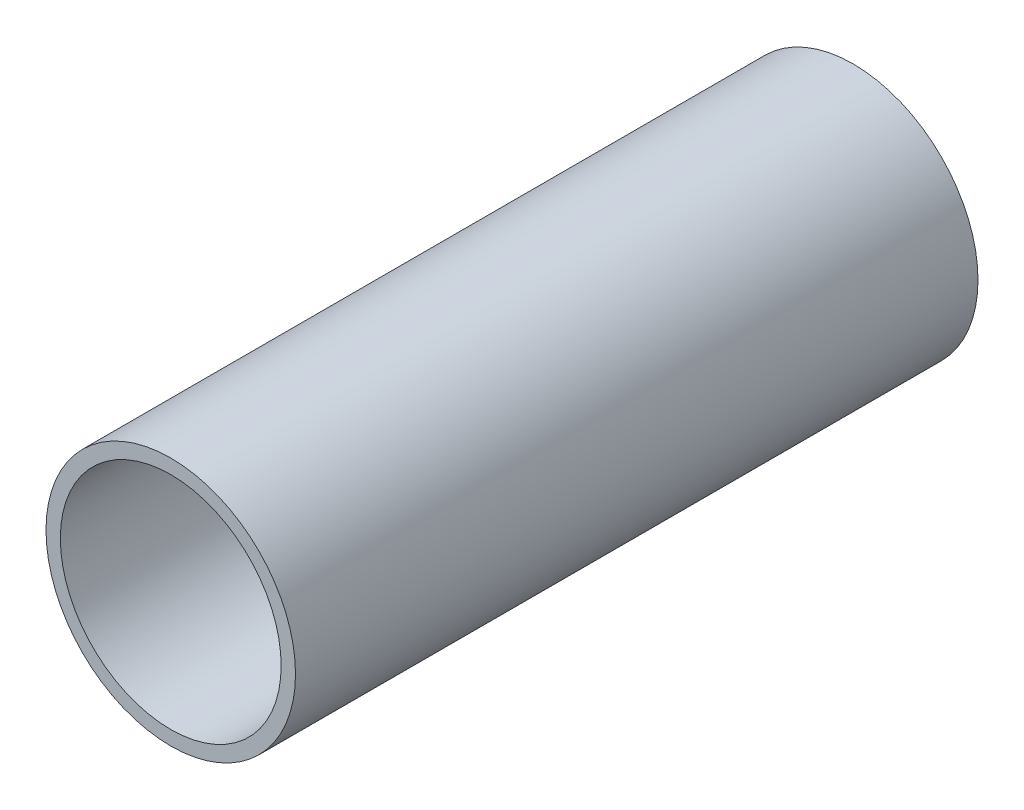
ISO-10303-21;
HEADER;
FILE_DESCRIPTION(('STEP AP214'),'2;1');
FILE_NAME('part.step','',(''),(''),'','','');
FILE_SCHEMA(('AUTOMOTIVE_DESIGN { 1 0 10303 214 1 1 1 1 }'));
ENDSEC;
DATA;
#1=APPLICATION_CONTEXT('core data for automotive mechanical design processes');
#2=APPLICATION_PROTOCOL_DEFINITION('international standard','automotive_design',2000,#1);
#3=PRODUCT_CONTEXT('',#1,'mechanical');
#4=PRODUCT('Part','Part','',(#3));
#5=PRODUCT_RELATED_PRODUCT_CATEGORY('part','',(#4));
#6=PRODUCT_DEFINITION_FORMATION('','',#4);
#7=PRODUCT_DEFINITION_CONTEXT('part definition',#1,'design');
#8=PRODUCT_DEFINITION('design','',#6,#7);
#9=PRODUCT_DEFINITION_SHAPE('','',#8);
#10=(LENGTH_UNIT() NAMED_UNIT(*) SI_UNIT(.MILLI.,.METRE.));
#11=(NAMED_UNIT(*) PLANE_ANGLE_UNIT() SI_UNIT($,.RADIAN.));
#12=(NAMED_UNIT(*) SI_UNIT($,.STERADIAN.) SOLID_ANGLE_UNIT());
#13=UNCERTAINTY_MEASURE_WITH_UNIT(LENGTH_MEASURE(1.E-05),#10,'distance_accuracy_value','');
#14=(GEOMETRIC_REPRESENTATION_CONTEXT(3) GLOBAL_UNCERTAINTY_ASSIGNED_CONTEXT((#13)) GLOBAL_UNIT_ASSIGNED_CONTEXT((#10,
#11,#12)) REPRESENTATION_CONTEXT('',''));
#15=CARTESIAN_POINT('',(0.,0.,0.));
#16=DIRECTION('',(0.,0.,1.));
#17=DIRECTION('',(1.,0.,0.));
#18=AXIS2_PLACEMENT_3D('',#15,#16,#17);
#19=CARTESIAN_POINT('',(0.,0.,476.));
#20=DIRECTION('',(0.,0.,1.));
#21=DIRECTION('',(1.,0.,0.));
#22=AXIS2_PLACEMENT_3D('',#19,#20,#21);
#23=PLANE('',#22);
#24=CARTESIAN_POINT('',(0.,0.,476.));
#25=DIRECTION('',(0.,0.,1.));
#26=DIRECTION('',(1.,0.,0.));
#27=AXIS2_PLACEMENT_3D('',#24,#25,#26);
#28=CIRCLE('',#27,87.);
#29=CARTESIAN_POINT('',(-87.,0.,476.));
#30=VERTEX_POINT('',#29);
#31=EDGE_CURVE('E10',#30,#30,#28,.T.);
#32=ORIENTED_EDGE('',*,*,#31,.T.);
#33=EDGE_LOOP('',(#32));
#34=FACE_BOUND('',#33,.T.);
#35=CARTESIAN_POINT('',(0.,0.,476.));
#36=DIRECTION('',(0.,0.,1.));
#37=DIRECTION('',(1.,0.,0.));
#38=AXIS2_PLACEMENT_3D('',#35,#36,#37);
#39=CIRCLE('',#38,77.);
#40=CARTESIAN_POINT('',(-77.,0.,476.));
#41=VERTEX_POINT('',#40);
#42=EDGE_CURVE('E55',#41,#41,#39,.T.);
#43=ORIENTED_EDGE('',*,*,#42,.F.);
#44=EDGE_LOOP('',(#43));
#45=FACE_BOUND('',#44,.T.);
#46=ADVANCED_FACE('F42',(#34,#45),#23,.T.);
#47=CARTESIAN_POINT('',(0.,0.,0.));
#48=DIRECTION('',(0.,0.,1.));
#49=DIRECTION('',(1.,0.,0.));
#50=AXIS2_PLACEMENT_3D('',#47,#48,#49);
#51=PLANE('',#50);
#52=CARTESIAN_POINT('',(0.,0.,0.));
#53=DIRECTION('',(0.,0.,1.));
#54=DIRECTION('',(1.,0.,0.));
#55=AXIS2_PLACEMENT_3D('',#52,#53,#54);
#56=CIRCLE('',#55,87.);
#57=CARTESIAN_POINT('',(-87.,0.,0.));
#58=VERTEX_POINT('',#57);
#59=EDGE_CURVE('E46',#58,#58,#56,.T.);
#60=ORIENTED_EDGE('',*,*,#59,.F.);
#61=EDGE_LOOP('',(#60));
#62=FACE_BOUND('',#61,.T.);
#63=CARTESIAN_POINT('',(0.,0.,0.));
#64=DIRECTION('',(0.,0.,1.));
#65=DIRECTION('',(1.,0.,0.));
#66=AXIS2_PLACEMENT_3D('',#63,#64,#65);
#67=CIRCLE('',#66,77.);
#68=CARTESIAN_POINT('',(-77.,0.,0.));
#69=VERTEX_POINT('',#68);
#70=EDGE_CURVE('E57',#69,#69,#67,.T.);
#71=ORIENTED_EDGE('',*,*,#70,.T.);
#72=EDGE_LOOP('',(#71));
#73=FACE_BOUND('',#72,.T.);
#74=ADVANCED_FACE('F69',(#62,#73),#51,.F.);
#75=CARTESIAN_POINT('',(0.,0.,476.));
#76=DIRECTION('',(0.,0.,-1.));
#77=DIRECTION('',(-1.,0.,0.));
#78=AXIS2_PLACEMENT_3D('',#75,#76,#77);
#79=CYLINDRICAL_SURFACE('',#78,87.);
#80=CARTESIAN_POINT('',(-87.,0.,476.));
#81=CARTESIAN_POINT('',(-87.,0.,471.041666666667));
#82=CARTESIAN_POINT('',(-87.,0.,466.083333333333));
#83=CARTESIAN_POINT('',(-87.,0.,456.166666666667));
#84=CARTESIAN_POINT('',(-87.,0.,451.208333333333));
#85=CARTESIAN_POINT('',(-87.,0.,441.291666666667));
#86=CARTESIAN_POINT('',(-87.,0.,436.333333333333));
#87=CARTESIAN_POINT('',(-87.,0.,426.416666666667));
#88=CARTESIAN_POINT('',(-87.,0.,421.458333333333));
#89=CARTESIAN_POINT('',(-87.,0.,411.541666666667));
#90=CARTESIAN_POINT('',(-87.,0.,406.583333333333));
#91=CARTESIAN_POINT('',(-87.,0.,396.666666666667));
#92=CARTESIAN_POINT('',(-87.,0.,391.708333333333));
#93=CARTESIAN_POINT('',(-87.,0.,381.791666666667));
#94=CARTESIAN_POINT('',(-87.,0.,376.833333333333));
#95=CARTESIAN_POINT('',(-87.,0.,366.916666666667));
#96=CARTESIAN_POINT('',(-87.,0.,361.958333333333));
#97=CARTESIAN_POINT('',(-87.,0.,352.041666666667));
#98=CARTESIAN_POINT('',(-87.,0.,347.083333333333));
#99=CARTESIAN_POINT('',(-87.,0.,337.166666666667));
#100=CARTESIAN_POINT('',(-87.,0.,332.208333333333));
#101=CARTESIAN_POINT('',(-87.,0.,322.291666666667));
#102=CARTESIAN_POINT('',(-87.,0.,317.333333333333));
#103=CARTESIAN_POINT('',(-87.,0.,307.416666666667));
#104=CARTESIAN_POINT('',(-87.,0.,302.458333333333));
#105=CARTESIAN_POINT('',(-87.,0.,292.541666666667));
#106=CARTESIAN_POINT('',(-87.,0.,287.583333333333));
#107=CARTESIAN_POINT('',(-87.,0.,277.666666666667));
#108=CARTESIAN_POINT('',(-87.,0.,272.708333333333));
#109=CARTESIAN_POINT('',(-87.,0.,262.791666666667));
#110=CARTESIAN_POINT('',(-87.,0.,257.833333333333));
#111=CARTESIAN_POINT('',(-87.,0.,247.916666666667));
#112=CARTESIAN_POINT('',(-87.,0.,242.958333333333));
#113=CARTESIAN_POINT('',(-87.,0.,233.041666666667));
#114=CARTESIAN_POINT('',(-87.,0.,228.083333333333));
#115=CARTESIAN_POINT('',(-87.,0.,218.166666666667));
#116=CARTESIAN_POINT('',(-87.,0.,213.208333333333));
#117=CARTESIAN_POINT('',(-87.,0.,203.291666666667));
#118=CARTESIAN_POINT('',(-87.,0.,198.333333333333));
#119=CARTESIAN_POINT('',(-87.,0.,188.416666666667));
#120=CARTESIAN_POINT('',(-87.,0.,183.458333333333));
#121=CARTESIAN_POINT('',(-87.,0.,173.541666666667));
#122=CARTESIAN_POINT('',(-87.,0.,168.583333333333));
#123=CARTESIAN_POINT('',(-87.,0.,158.666666666667));
#124=CARTESIAN_POINT('',(-87.,0.,153.708333333333));
#125=CARTESIAN_POINT('',(-87.,0.,143.791666666667));
#126=CARTESIAN_POINT('',(-87.,0.,138.833333333333));
#127=CARTESIAN_POINT('',(-87.,0.,128.916666666667));
#128=CARTESIAN_POINT('',(-87.,0.,123.958333333333));
#129=CARTESIAN_POINT('',(-87.,0.,114.041666666667));
#130=CARTESIAN_POINT('',(-87.,0.,109.083333333333));
#131=CARTESIAN_POINT('',(-87.,0.,99.1666666666667));
#132=CARTESIAN_POINT('',(-87.,0.,94.2083333333333));
#133=CARTESIAN_POINT('',(-87.,0.,84.2916666666667));
#134=CARTESIAN_POINT('',(-87.,0.,79.3333333333334));
#135=CARTESIAN_POINT('',(-87.,0.,69.4166666666667));
#136=CARTESIAN_POINT('',(-87.,0.,64.4583333333333));
#137=CARTESIAN_POINT('',(-87.,0.,54.5416666666667));
#138=CARTESIAN_POINT('',(-87.,0.,49.5833333333334));
#139=CARTESIAN_POINT('',(-87.,0.,39.6666666666667));
#140=CARTESIAN_POINT('',(-87.,0.,34.7083333333333));
#141=CARTESIAN_POINT('',(-87.,0.,24.7916666666667));
#142=CARTESIAN_POINT('',(-87.,0.,19.8333333333334));
#143=CARTESIAN_POINT('',(-87.,0.,9.91666666666668));
#144=CARTESIAN_POINT('',(-87.,0.,4.95833333333333));
#145=CARTESIAN_POINT('',(-87.,0.,0.));
#146=B_SPLINE_CURVE_WITH_KNOTS('',3,(#80,#81,#82,#83,#84,#85,#86,#87,#88,#89,#90,#91,#92,#93,
#94,#95,#96,#97,#98,#99,#100,#101,#102,#103,#104,#105,#106,#107,#108,#109,#110,#111,#112,#113,
#114,#115,#116,#117,#118,#119,#120,#121,#122,#123,#124,#125,#126,#127,#128,#129,#130,#131,#132,
#133,#134,#135,#136,#137,#138,#139,#140,#141,#142,#143,#144,#145),.UNSPECIFIED.,.F.,.F.,(4,2,2,
2,2,2,2,2,2,2,2,2,2,2,2,2,2,2,2,2,2,2,2,2,2,2,2,2,2,2,2,2,4),(0.,14.875,29.7500000000001,44.625,
59.5,74.375,89.2500000000001,104.125,119.,133.875,148.75,163.625,178.5,193.375,208.25,223.125,
238.,252.875,267.75,282.625,297.5,312.375,327.25,342.125,357.,371.875,386.75,401.625,416.5,
431.375,446.25,461.125,476.),.UNSPECIFIED.);
#147=EDGE_CURVE('BSEAM44',#30,#58,#146,.T.);
#148=ORIENTED_EDGE('',*,*,#31,.F.);
#149=ORIENTED_EDGE('',*,*,#59,.T.);
#150=ORIENTED_EDGE('',*,*,#147,.T.);
#151=ORIENTED_EDGE('',*,*,#147,.F.);
#152=EDGE_LOOP('',(#148,#150,#149,#151));
#153=FACE_BOUND('',#152,.T.);
#154=ADVANCED_FACE('F44',(#153),#79,.T.);
#155=CARTESIAN_POINT('',(0.,0.,476.));
#156=DIRECTION('',(0.,0.,-1.));
#157=DIRECTION('',(-1.,0.,0.));
#158=AXIS2_PLACEMENT_3D('',#155,#156,#157);
#159=CYLINDRICAL_SURFACE('',#158,77.);
#160=CARTESIAN_POINT('',(-77.,0.,476.));
#161=CARTESIAN_POINT('',(-77.,0.,471.041666666667));
#162=CARTESIAN_POINT('',(-77.,0.,466.083333333333));
#163=CARTESIAN_POINT('',(-77.,0.,456.166666666667));
#164=CARTESIAN_POINT('',(-77.,0.,451.208333333333));
#165=CARTESIAN_POINT('',(-77.,0.,441.291666666667));
#166=CARTESIAN_POINT('',(-77.,0.,436.333333333333));
#167=CARTESIAN_POINT('',(-77.,0.,426.416666666667));
#168=CARTESIAN_POINT('',(-77.,0.,421.458333333333));
#169=CARTESIAN_POINT('',(-77.,0.,411.541666666667));
#170=CARTESIAN_POINT('',(-77.,0.,406.583333333333));
#171=CARTESIAN_POINT('',(-77.,0.,396.666666666667));
#172=CARTESIAN_POINT('',(-77.,0.,391.708333333333));
#173=CARTESIAN_POINT('',(-77.,0.,381.791666666667));
#174=CARTESIAN_POINT('',(-77.,0.,376.833333333333));
#175=CARTESIAN_POINT('',(-77.,0.,366.916666666667));
#176=CARTESIAN_POINT('',(-77.,0.,361.958333333333));
#177=CARTESIAN_POINT('',(-77.,0.,352.041666666667));
#178=CARTESIAN_POINT('',(-77.,0.,347.083333333333));
#179=CARTESIAN_POINT('',(-77.,0.,337.166666666667));
#180=CARTESIAN_POINT('',(-77.,0.,332.208333333333));
#181=CARTESIAN_POINT('',(-77.,0.,322.291666666667));
#182=CARTESIAN_POINT('',(-77.,0.,317.333333333333));
#183=CARTESIAN_POINT('',(-77.,0.,307.416666666667));
#184=CARTESIAN_POINT('',(-77.,0.,302.458333333333));
#185=CARTESIAN_POINT('',(-77.,0.,292.541666666667));
#186=CARTESIAN_POINT('',(-77.,0.,287.583333333333));
#187=CARTESIAN_POINT('',(-77.,0.,277.666666666667));
#188=CARTESIAN_POINT('',(-77.,0.,272.708333333333));
#189=CARTESIAN_POINT('',(-77.,0.,262.791666666667));
#190=CARTESIAN_POINT('',(-77.,0.,257.833333333333));
#191=CARTESIAN_POINT('',(-77.,0.,247.916666666667));
#192=CARTESIAN_POINT('',(-77.,0.,242.958333333333));
#193=CARTESIAN_POINT('',(-77.,0.,233.041666666667));
#194=CARTESIAN_POINT('',(-77.,0.,228.083333333333));
#195=CARTESIAN_POINT('',(-77.,0.,218.166666666667));
#196=CARTESIAN_POINT('',(-77.,0.,213.208333333333));
#197=CARTESIAN_POINT('',(-77.,0.,203.291666666667));
#198=CARTESIAN_POINT('',(-77.,0.,198.333333333333));
#199=CARTESIAN_POINT('',(-77.,0.,188.416666666667));
#200=CARTESIAN_POINT('',(-77.,0.,183.458333333333));
#201=CARTESIAN_POINT('',(-77.,0.,173.541666666667));
#202=CARTESIAN_POINT('',(-77.,0.,168.583333333333));
#203=CARTESIAN_POINT('',(-77.,0.,158.666666666667));
#204=CARTESIAN_POINT('',(-77.,0.,153.708333333333));
#205=CARTESIAN_POINT('',(-77.,0.,143.791666666667));
#206=CARTESIAN_POINT('',(-77.,0.,138.833333333333));
#207=CARTESIAN_POINT('',(-77.,0.,128.916666666667));
#208=CARTESIAN_POINT('',(-77.,0.,123.958333333333));
#209=CARTESIAN_POINT('',(-77.,0.,114.041666666667));
#210=CARTESIAN_POINT('',(-77.,0.,109.083333333333));
#211=CARTESIAN_POINT('',(-77.,0.,99.1666666666667));
#212=CARTESIAN_POINT('',(-77.,0.,94.2083333333333));
#213=CARTESIAN_POINT('',(-77.,0.,84.2916666666667));
#214=CARTESIAN_POINT('',(-77.,0.,79.3333333333334));
#215=CARTESIAN_POINT('',(-77.,0.,69.4166666666667));
#216=CARTESIAN_POINT('',(-77.,0.,64.4583333333333));
#217=CARTESIAN_POINT('',(-77.,0.,54.5416666666667));
#218=CARTESIAN_POINT('',(-77.,0.,49.5833333333334));
#219=CARTESIAN_POINT('',(-77.,0.,39.6666666666667));
#220=CARTESIAN_POINT('',(-77.,0.,34.7083333333333));
#221=CARTESIAN_POINT('',(-77.,0.,24.7916666666667));
#222=CARTESIAN_POINT('',(-77.,0.,19.8333333333334));
#223=CARTESIAN_POINT('',(-77.,0.,9.91666666666668));
#224=CARTESIAN_POINT('',(-77.,0.,4.95833333333333));
#225=CARTESIAN_POINT('',(-77.,0.,0.));
#226=B_SPLINE_CURVE_WITH_KNOTS('',3,(#160,#161,#162,#163,#164,#165,#166,#167,#168,#169,#170,
#171,#172,#173,#174,#175,#176,#177,#178,#179,#180,#181,#182,#183,#184,#185,#186,#187,#188,#189,
#190,#191,#192,#193,#194,#195,#196,#197,#198,#199,#200,#201,#202,#203,#204,#205,#206,#207,#208,
#209,#210,#211,#212,#213,#214,#215,#216,#217,#218,#219,#220,#221,#222,#223,#224,#225),
.UNSPECIFIED.,.F.,.F.,(4,2,2,2,2,2,2,2,2,2,2,2,2,2,2,2,2,2,2,2,2,2,2,2,2,2,2,2,2,2,2,2,4),(0.,
14.875,29.7500000000001,44.625,59.5,74.375,89.2500000000001,104.125,119.,133.875,148.75,163.625,
178.5,193.375,208.25,223.125,238.,252.875,267.75,282.625,297.5,312.375,327.25,342.125,357.,
371.875,386.75,401.625,416.5,431.375,446.25,461.125,476.),.UNSPECIFIED.);
#227=EDGE_CURVE('BSEAM65',#41,#69,#226,.T.);
#228=ORIENTED_EDGE('',*,*,#42,.T.);
#229=ORIENTED_EDGE('',*,*,#70,.F.);
#230=ORIENTED_EDGE('',*,*,#227,.T.);
#231=ORIENTED_EDGE('',*,*,#227,.F.);
#232=EDGE_LOOP('',(#228,#230,#229,#231));
#233=FACE_BOUND('',#232,.T.);
#234=ADVANCED_FACE('F65',(#233),#159,.F.);
#235=CLOSED_SHELL('',(#46,#74,#154,#234));
#236=MANIFOLD_SOLID_BREP('B2',#235);
#237=ADVANCED_BREP_SHAPE_REPRESENTATION('',(#18,#236),#14);
#238=SHAPE_DEFINITION_REPRESENTATION(#9,#237);
ENDSEC;
END-ISO-10303-21;
